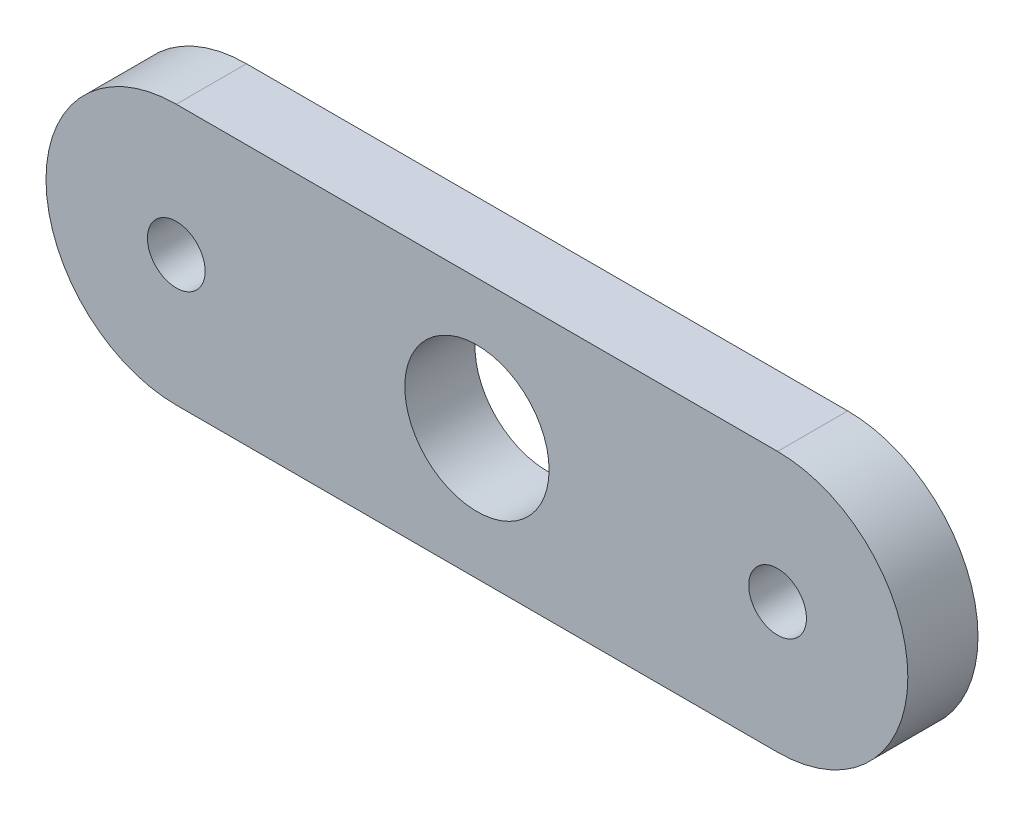
ISO-10303-21;
HEADER;
FILE_DESCRIPTION(('STEP AP214'),'2;1');
FILE_NAME('part.step','',(''),(''),'','','');
FILE_SCHEMA(('AUTOMOTIVE_DESIGN { 1 0 10303 214 1 1 1 1 }'));
ENDSEC;
DATA;
#1=APPLICATION_CONTEXT('core data for automotive mechanical design processes');
#2=APPLICATION_PROTOCOL_DEFINITION('international standard','automotive_design',2000,#1);
#3=PRODUCT_CONTEXT('',#1,'mechanical');
#4=PRODUCT('Part','Part','',(#3));
#5=PRODUCT_RELATED_PRODUCT_CATEGORY('part','',(#4));
#6=PRODUCT_DEFINITION_FORMATION('','',#4);
#7=PRODUCT_DEFINITION_CONTEXT('part definition',#1,'design');
#8=PRODUCT_DEFINITION('design','',#6,#7);
#9=PRODUCT_DEFINITION_SHAPE('','',#8);
#10=(LENGTH_UNIT() NAMED_UNIT(*) SI_UNIT(.MILLI.,.METRE.));
#11=(NAMED_UNIT(*) PLANE_ANGLE_UNIT() SI_UNIT($,.RADIAN.));
#12=(NAMED_UNIT(*) SI_UNIT($,.STERADIAN.) SOLID_ANGLE_UNIT());
#13=UNCERTAINTY_MEASURE_WITH_UNIT(LENGTH_MEASURE(1.E-05),#10,'distance_accuracy_value','');
#14=(GEOMETRIC_REPRESENTATION_CONTEXT(3) GLOBAL_UNCERTAINTY_ASSIGNED_CONTEXT((#13)) GLOBAL_UNIT_ASSIGNED_CONTEXT((#10,
#11,#12)) REPRESENTATION_CONTEXT('',''));
#15=CARTESIAN_POINT('',(0.,0.,0.));
#16=DIRECTION('',(0.,0.,1.));
#17=DIRECTION('',(1.,0.,0.));
#18=AXIS2_PLACEMENT_3D('',#15,#16,#17);
#19=CARTESIAN_POINT('',(-15.,0.,0.));
#20=DIRECTION('',(0.,0.,1.));
#21=DIRECTION('',(1.,0.,0.));
#22=AXIS2_PLACEMENT_3D('',#19,#20,#21);
#23=PLANE('',#22);
#24=CARTESIAN_POINT('',(15.,0.,0.));
#25=DIRECTION('',(0.,0.,1.));
#26=DIRECTION('',(1.,0.,0.));
#27=AXIS2_PLACEMENT_3D('',#24,#25,#26);
#28=CIRCLE('',#27,1.44);
#29=CARTESIAN_POINT('',(16.44,0.,0.));
#30=VERTEX_POINT('',#29);
#31=EDGE_CURVE('E108',#30,#30,#28,.T.);
#32=ORIENTED_EDGE('',*,*,#31,.T.);
#33=EDGE_LOOP('',(#32));
#34=FACE_BOUND('',#33,.T.);
#35=CARTESIAN_POINT('',(-15.,0.,0.));
#36=DIRECTION('',(0.,0.,1.));
#37=DIRECTION('',(1.,0.,0.));
#38=AXIS2_PLACEMENT_3D('',#35,#36,#37);
#39=CIRCLE('',#38,6.5);
#40=CARTESIAN_POINT('',(-15.,6.5,0.));
#41=VERTEX_POINT('',#40);
#42=CARTESIAN_POINT('',(-15.,-6.5,0.));
#43=VERTEX_POINT('',#42);
#44=EDGE_CURVE('E81',#41,#43,#39,.T.);
#45=ORIENTED_EDGE('',*,*,#44,.F.);
#46=DIRECTION('',(-1.,0.,0.));
#47=VECTOR('',#46,1.);
#48=CARTESIAN_POINT('',(-15.,6.5,0.));
#49=LINE('',#48,#47);
#50=CARTESIAN_POINT('',(15.,6.5,0.));
#51=VERTEX_POINT('',#50);
#52=EDGE_CURVE('E50',#51,#41,#49,.T.);
#53=ORIENTED_EDGE('',*,*,#52,.F.);
#54=CARTESIAN_POINT('',(15.,0.,0.));
#55=DIRECTION('',(0.,0.,1.));
#56=DIRECTION('',(1.,0.,0.));
#57=AXIS2_PLACEMENT_3D('',#54,#55,#56);
#58=CIRCLE('',#57,6.5);
#59=CARTESIAN_POINT('',(15.,-6.50000000000001,0.));
#60=VERTEX_POINT('',#59);
#61=EDGE_CURVE('E58',#60,#51,#58,.T.);
#62=ORIENTED_EDGE('',*,*,#61,.F.);
#63=DIRECTION('',(1.,0.,0.));
#64=VECTOR('',#63,1.);
#65=CARTESIAN_POINT('',(-15.,-6.5,0.));
#66=LINE('',#65,#64);
#67=EDGE_CURVE('E115',#43,#60,#66,.T.);
#68=ORIENTED_EDGE('',*,*,#67,.F.);
#69=EDGE_LOOP('',(#45,#53,#62,#68));
#70=FACE_BOUND('',#69,.T.);
#71=CARTESIAN_POINT('',(-15.,0.,0.));
#72=DIRECTION('',(0.,0.,1.));
#73=DIRECTION('',(1.,0.,0.));
#74=AXIS2_PLACEMENT_3D('',#71,#72,#73);
#75=CIRCLE('',#74,1.44);
#76=CARTESIAN_POINT('',(-13.56,0.,0.));
#77=VERTEX_POINT('',#76);
#78=EDGE_CURVE('E111',#77,#77,#75,.T.);
#79=ORIENTED_EDGE('',*,*,#78,.T.);
#80=EDGE_LOOP('',(#79));
#81=FACE_BOUND('',#80,.T.);
#82=CARTESIAN_POINT('',(0.,0.,0.));
#83=DIRECTION('',(0.,0.,1.));
#84=DIRECTION('',(1.,0.,0.));
#85=AXIS2_PLACEMENT_3D('',#82,#83,#84);
#86=CIRCLE('',#85,3.6);
#87=CARTESIAN_POINT('',(3.6,0.,0.));
#88=VERTEX_POINT('',#87);
#89=EDGE_CURVE('E105',#88,#88,#86,.T.);
#90=ORIENTED_EDGE('',*,*,#89,.T.);
#91=EDGE_LOOP('',(#90));
#92=FACE_BOUND('',#91,.T.);
#93=ADVANCED_FACE('F35',(#34,#70,#81,#92),#23,.F.);
#94=CARTESIAN_POINT('',(-15.,0.,2.));
#95=DIRECTION('',(0.,0.,-1.));
#96=DIRECTION('',(-1.,0.,0.));
#97=AXIS2_PLACEMENT_3D('',#94,#95,#96);
#98=CYLINDRICAL_SURFACE('',#97,6.5);
#99=ORIENTED_EDGE('',*,*,#44,.T.);
#100=DIRECTION('',(0.,0.,-1.));
#101=VECTOR('',#100,1.);
#102=CARTESIAN_POINT('',(-15.,-6.5,2.));
#103=LINE('',#102,#101);
#104=CARTESIAN_POINT('',(-15.,-6.5,3.5));
#105=VERTEX_POINT('',#104);
#106=EDGE_CURVE('E11',#105,#43,#103,.T.);
#107=ORIENTED_EDGE('',*,*,#106,.F.);
#108=CARTESIAN_POINT('',(-15.,0.,3.5));
#109=DIRECTION('',(0.,0.,1.));
#110=DIRECTION('',(1.,0.,0.));
#111=AXIS2_PLACEMENT_3D('',#108,#109,#110);
#112=CIRCLE('',#111,6.5);
#113=CARTESIAN_POINT('',(-15.,6.5,3.5));
#114=VERTEX_POINT('',#113);
#115=EDGE_CURVE('E79',#114,#105,#112,.T.);
#116=ORIENTED_EDGE('',*,*,#115,.F.);
#117=DIRECTION('',(0.,0.,-1.));
#118=VECTOR('',#117,1.);
#119=CARTESIAN_POINT('',(-15.,6.5,2.));
#120=LINE('',#119,#118);
#121=EDGE_CURVE('E119',#114,#41,#120,.T.);
#122=ORIENTED_EDGE('',*,*,#121,.T.);
#123=EDGE_LOOP('',(#99,#107,#116,#122));
#124=FACE_BOUND('',#123,.T.);
#125=ADVANCED_FACE('F37',(#124),#98,.T.);
#126=CARTESIAN_POINT('',(-15.,-6.5,2.));
#127=DIRECTION('',(0.,1.,0.));
#128=DIRECTION('',(0.,0.,1.));
#129=AXIS2_PLACEMENT_3D('',#126,#127,#128);
#130=PLANE('',#129);
#131=ORIENTED_EDGE('',*,*,#67,.T.);
#132=DIRECTION('',(0.,0.,-1.));
#133=VECTOR('',#132,1.);
#134=CARTESIAN_POINT('',(15.,-6.50000000000001,2.));
#135=LINE('',#134,#133);
#136=CARTESIAN_POINT('',(15.,-6.50000000000001,3.5));
#137=VERTEX_POINT('',#136);
#138=EDGE_CURVE('E43',#137,#60,#135,.T.);
#139=ORIENTED_EDGE('',*,*,#138,.F.);
#140=DIRECTION('',(1.,0.,0.));
#141=VECTOR('',#140,1.);
#142=CARTESIAN_POINT('',(-15.,-6.5,3.5));
#143=LINE('',#142,#141);
#144=EDGE_CURVE('E84',#105,#137,#143,.T.);
#145=ORIENTED_EDGE('',*,*,#144,.F.);
#146=ORIENTED_EDGE('',*,*,#106,.T.);
#147=EDGE_LOOP('',(#131,#139,#145,#146));
#148=FACE_BOUND('',#147,.T.);
#149=ADVANCED_FACE('F85',(#148),#130,.F.);
#150=CARTESIAN_POINT('',(15.,0.,2.));
#151=DIRECTION('',(0.,0.,-1.));
#152=DIRECTION('',(-1.,0.,0.));
#153=AXIS2_PLACEMENT_3D('',#150,#151,#152);
#154=CYLINDRICAL_SURFACE('',#153,6.5);
#155=ORIENTED_EDGE('',*,*,#61,.T.);
#156=DIRECTION('',(0.,0.,-1.));
#157=VECTOR('',#156,1.);
#158=CARTESIAN_POINT('',(15.,6.5,2.));
#159=LINE('',#158,#157);
#160=CARTESIAN_POINT('',(15.,6.5,3.5));
#161=VERTEX_POINT('',#160);
#162=EDGE_CURVE('E121',#161,#51,#159,.T.);
#163=ORIENTED_EDGE('',*,*,#162,.F.);
#164=CARTESIAN_POINT('',(15.,0.,3.5));
#165=DIRECTION('',(0.,0.,1.));
#166=DIRECTION('',(1.,0.,0.));
#167=AXIS2_PLACEMENT_3D('',#164,#165,#166);
#168=CIRCLE('',#167,6.5);
#169=EDGE_CURVE('E89',#137,#161,#168,.T.);
#170=ORIENTED_EDGE('',*,*,#169,.F.);
#171=ORIENTED_EDGE('',*,*,#138,.T.);
#172=EDGE_LOOP('',(#155,#163,#170,#171));
#173=FACE_BOUND('',#172,.T.);
#174=ADVANCED_FACE('F122',(#173),#154,.T.);
#175=CARTESIAN_POINT('',(-15.,6.5,2.));
#176=DIRECTION('',(0.,-1.,0.));
#177=DIRECTION('',(0.,0.,-1.));
#178=AXIS2_PLACEMENT_3D('',#175,#176,#177);
#179=PLANE('',#178);
#180=ORIENTED_EDGE('',*,*,#52,.T.);
#181=ORIENTED_EDGE('',*,*,#121,.F.);
#182=DIRECTION('',(-1.,0.,0.));
#183=VECTOR('',#182,1.);
#184=CARTESIAN_POINT('',(-15.,6.5,3.5));
#185=LINE('',#184,#183);
#186=EDGE_CURVE('E95',#161,#114,#185,.T.);
#187=ORIENTED_EDGE('',*,*,#186,.F.);
#188=ORIENTED_EDGE('',*,*,#162,.T.);
#189=EDGE_LOOP('',(#180,#181,#187,#188));
#190=FACE_BOUND('',#189,.T.);
#191=ADVANCED_FACE('F156',(#190),#179,.F.);
#192=CARTESIAN_POINT('',(-15.,0.,2.));
#193=DIRECTION('',(0.,0.,-1.));
#194=DIRECTION('',(-1.,0.,0.));
#195=AXIS2_PLACEMENT_3D('',#192,#193,#194);
#196=CYLINDRICAL_SURFACE('',#195,1.44);
#197=ORIENTED_EDGE('',*,*,#78,.F.);
#198=EDGE_LOOP('',(#197));
#199=FACE_BOUND('',#198,.T.);
#200=CARTESIAN_POINT('',(-15.,0.,3.5));
#201=DIRECTION('',(0.,0.,1.));
#202=DIRECTION('',(1.,0.,0.));
#203=AXIS2_PLACEMENT_3D('',#200,#201,#202);
#204=CIRCLE('',#203,1.44);
#205=CARTESIAN_POINT('',(-13.56,0.,3.5));
#206=VERTEX_POINT('',#205);
#207=EDGE_CURVE('E96',#206,#206,#204,.T.);
#208=ORIENTED_EDGE('',*,*,#207,.T.);
#209=EDGE_LOOP('',(#208));
#210=FACE_BOUND('',#209,.T.);
#211=ADVANCED_FACE('F153',(#199,#210),#196,.F.);
#212=CARTESIAN_POINT('',(15.,0.,2.));
#213=DIRECTION('',(0.,0.,-1.));
#214=DIRECTION('',(-1.,0.,0.));
#215=AXIS2_PLACEMENT_3D('',#212,#213,#214);
#216=CYLINDRICAL_SURFACE('',#215,1.44);
#217=ORIENTED_EDGE('',*,*,#31,.F.);
#218=EDGE_LOOP('',(#217));
#219=FACE_BOUND('',#218,.T.);
#220=CARTESIAN_POINT('',(15.,0.,3.5));
#221=DIRECTION('',(0.,0.,1.));
#222=DIRECTION('',(1.,0.,0.));
#223=AXIS2_PLACEMENT_3D('',#220,#221,#222);
#224=CIRCLE('',#223,1.44);
#225=CARTESIAN_POINT('',(16.44,0.,3.5));
#226=VERTEX_POINT('',#225);
#227=EDGE_CURVE('E99',#226,#226,#224,.T.);
#228=ORIENTED_EDGE('',*,*,#227,.T.);
#229=EDGE_LOOP('',(#228));
#230=FACE_BOUND('',#229,.T.);
#231=ADVANCED_FACE('F135',(#219,#230),#216,.F.);
#232=CARTESIAN_POINT('',(0.,0.,2.));
#233=DIRECTION('',(0.,0.,-1.));
#234=DIRECTION('',(-1.,0.,0.));
#235=AXIS2_PLACEMENT_3D('',#232,#233,#234);
#236=CYLINDRICAL_SURFACE('',#235,3.6);
#237=ORIENTED_EDGE('',*,*,#89,.F.);
#238=EDGE_LOOP('',(#237));
#239=FACE_BOUND('',#238,.T.);
#240=CARTESIAN_POINT('',(0.,0.,3.5));
#241=DIRECTION('',(0.,0.,1.));
#242=DIRECTION('',(1.,0.,0.));
#243=AXIS2_PLACEMENT_3D('',#240,#241,#242);
#244=CIRCLE('',#243,3.6);
#245=CARTESIAN_POINT('',(3.6,0.,3.5));
#246=VERTEX_POINT('',#245);
#247=EDGE_CURVE('E139',#246,#246,#244,.T.);
#248=ORIENTED_EDGE('',*,*,#247,.T.);
#249=EDGE_LOOP('',(#248));
#250=FACE_BOUND('',#249,.T.);
#251=ADVANCED_FACE('F132',(#239,#250),#236,.F.);
#252=CARTESIAN_POINT('',(-15.,0.,3.5));
#253=DIRECTION('',(0.,0.,1.));
#254=DIRECTION('',(1.,0.,0.));
#255=AXIS2_PLACEMENT_3D('',#252,#253,#254);
#256=PLANE('',#255);
#257=ORIENTED_EDGE('',*,*,#227,.F.);
#258=EDGE_LOOP('',(#257));
#259=FACE_BOUND('',#258,.T.);
#260=ORIENTED_EDGE('',*,*,#115,.T.);
#261=ORIENTED_EDGE('',*,*,#144,.T.);
#262=ORIENTED_EDGE('',*,*,#169,.T.);
#263=ORIENTED_EDGE('',*,*,#186,.T.);
#264=EDGE_LOOP('',(#260,#261,#262,#263));
#265=FACE_BOUND('',#264,.T.);
#266=ORIENTED_EDGE('',*,*,#207,.F.);
#267=EDGE_LOOP('',(#266));
#268=FACE_BOUND('',#267,.T.);
#269=ORIENTED_EDGE('',*,*,#247,.F.);
#270=EDGE_LOOP('',(#269));
#271=FACE_BOUND('',#270,.T.);
#272=ADVANCED_FACE('F92',(#259,#265,#268,#271),#256,.T.);
#273=CLOSED_SHELL('',(#93,#125,#149,#174,#191,#211,#231,#251,#272));
#274=MANIFOLD_SOLID_BREP('B2',#273);
#275=ADVANCED_BREP_SHAPE_REPRESENTATION('',(#18,#274),#14);
#276=SHAPE_DEFINITION_REPRESENTATION(#9,#275);
ENDSEC;
END-ISO-10303-21;
